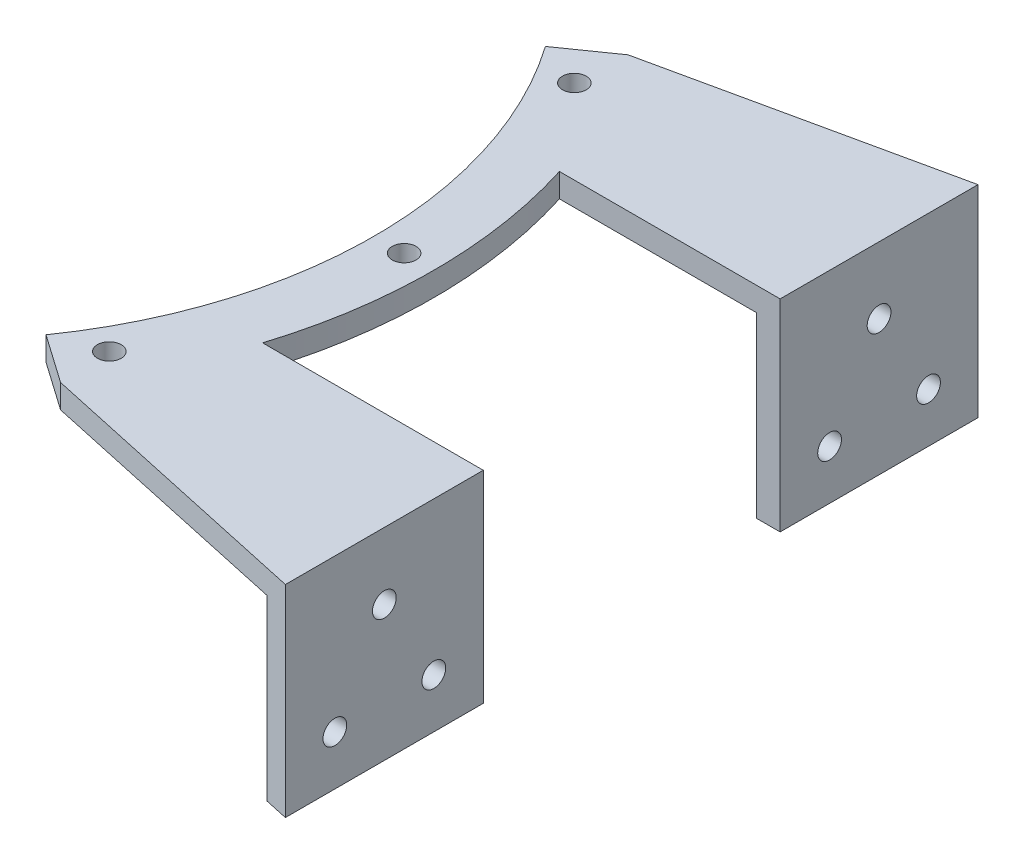
ISO-10303-21;
HEADER;
FILE_DESCRIPTION(('STEP AP214'),'2;1');
FILE_NAME('part.step','',(''),(''),'','','');
FILE_SCHEMA(('AUTOMOTIVE_DESIGN { 1 0 10303 214 1 1 1 1 }'));
ENDSEC;
DATA;
#1=APPLICATION_CONTEXT('core data for automotive mechanical design processes');
#2=APPLICATION_PROTOCOL_DEFINITION('international standard','automotive_design',2000,#1);
#3=PRODUCT_CONTEXT('',#1,'mechanical');
#4=PRODUCT('Part','Part','',(#3));
#5=PRODUCT_RELATED_PRODUCT_CATEGORY('part','',(#4));
#6=PRODUCT_DEFINITION_FORMATION('','',#4);
#7=PRODUCT_DEFINITION_CONTEXT('part definition',#1,'design');
#8=PRODUCT_DEFINITION('design','',#6,#7);
#9=PRODUCT_DEFINITION_SHAPE('','',#8);
#10=(LENGTH_UNIT() NAMED_UNIT(*) SI_UNIT(.MILLI.,.METRE.));
#11=(NAMED_UNIT(*) PLANE_ANGLE_UNIT() SI_UNIT($,.RADIAN.));
#12=(NAMED_UNIT(*) SI_UNIT($,.STERADIAN.) SOLID_ANGLE_UNIT());
#13=UNCERTAINTY_MEASURE_WITH_UNIT(LENGTH_MEASURE(1.E-05),#10,'distance_accuracy_value','');
#14=(GEOMETRIC_REPRESENTATION_CONTEXT(3) GLOBAL_UNCERTAINTY_ASSIGNED_CONTEXT((#13)) GLOBAL_UNIT_ASSIGNED_CONTEXT((#10,
#11,#12)) REPRESENTATION_CONTEXT('',''));
#15=CARTESIAN_POINT('',(0.,0.,0.));
#16=DIRECTION('',(0.,0.,1.));
#17=DIRECTION('',(1.,0.,0.));
#18=AXIS2_PLACEMENT_3D('',#15,#16,#17);
#19=CARTESIAN_POINT('',(0.,0.,0.));
#20=DIRECTION('',(0.,1.,0.));
#21=DIRECTION('',(0.,0.,1.));
#22=AXIS2_PLACEMENT_3D('',#19,#20,#21);
#23=PLANE('',#22);
#24=CARTESIAN_POINT('',(203.515969889343,0.,117.5));
#25=DIRECTION('',(0.,1.,0.));
#26=DIRECTION('',(0.,0.,1.));
#27=AXIS2_PLACEMENT_3D('',#24,#25,#26);
#28=CIRCLE('',#27,5.99999999999999);
#29=CARTESIAN_POINT('',(203.515969889343,0.,123.5));
#30=VERTEX_POINT('',#29);
#31=EDGE_CURVE('E191',#30,#30,#28,.T.);
#32=ORIENTED_EDGE('',*,*,#31,.T.);
#33=EDGE_LOOP('',(#32));
#34=FACE_BOUND('',#33,.T.);
#35=CARTESIAN_POINT('',(235.,0.,0.));
#36=DIRECTION('',(0.,1.,0.));
#37=DIRECTION('',(0.,0.,1.));
#38=AXIS2_PLACEMENT_3D('',#35,#36,#37);
#39=CIRCLE('',#38,5.99999999999999);
#40=CARTESIAN_POINT('',(235.,0.,5.99999999999999));
#41=VERTEX_POINT('',#40);
#42=EDGE_CURVE('E185',#41,#41,#39,.T.);
#43=ORIENTED_EDGE('',*,*,#42,.T.);
#44=EDGE_LOOP('',(#43));
#45=FACE_BOUND('',#44,.T.);
#46=CARTESIAN_POINT('',(203.515969889343,0.,-117.5));
#47=DIRECTION('',(0.,1.,0.));
#48=DIRECTION('',(0.,0.,1.));
#49=AXIS2_PLACEMENT_3D('',#46,#47,#48);
#50=CIRCLE('',#49,5.99999999999999);
#51=CARTESIAN_POINT('',(203.515969889343,0.,-111.5));
#52=VERTEX_POINT('',#51);
#53=EDGE_CURVE('E181',#52,#52,#50,.T.);
#54=ORIENTED_EDGE('',*,*,#53,.T.);
#55=EDGE_LOOP('',(#54));
#56=FACE_BOUND('',#55,.T.);
#57=DIRECTION('',(0.,0.,-1.));
#58=VECTOR('',#57,1.);
#59=CARTESIAN_POINT('',(338.,0.,-172.388158555313));
#60=LINE('',#59,#58);
#61=CARTESIAN_POINT('',(338.,0.,-75.));
#62=VERTEX_POINT('',#61);
#63=CARTESIAN_POINT('',(338.,0.,-172.388158555313));
#64=VERTEX_POINT('',#63);
#65=EDGE_CURVE('E153',#62,#64,#60,.T.);
#66=ORIENTED_EDGE('',*,*,#65,.F.);
#67=DIRECTION('',(1.,0.,0.));
#68=VECTOR('',#67,1.);
#69=CARTESIAN_POINT('',(350.,0.,-75.));
#70=LINE('',#69,#68);
#71=CARTESIAN_POINT('',(238.484800354236,0.,-75.));
#72=VERTEX_POINT('',#71);
#73=EDGE_CURVE('E158',#72,#62,#70,.T.);
#74=ORIENTED_EDGE('',*,*,#73,.F.);
#75=CARTESIAN_POINT('',(0.,0.,0.));
#76=DIRECTION('',(0.,1.,0.));
#77=DIRECTION('',(0.,0.,1.));
#78=AXIS2_PLACEMENT_3D('',#75,#76,#77);
#79=CIRCLE('',#78,250.);
#80=CARTESIAN_POINT('',(238.484800354236,0.,75.));
#81=VERTEX_POINT('',#80);
#82=EDGE_CURVE('E203',#81,#72,#79,.T.);
#83=ORIENTED_EDGE('',*,*,#82,.F.);
#84=DIRECTION('',(-1.,0.,0.));
#85=VECTOR('',#84,1.);
#86=CARTESIAN_POINT('',(350.,0.,75.));
#87=LINE('',#86,#85);
#88=CARTESIAN_POINT('',(338.,0.,75.));
#89=VERTEX_POINT('',#88);
#90=EDGE_CURVE('E233',#89,#81,#87,.T.);
#91=ORIENTED_EDGE('',*,*,#90,.F.);
#92=DIRECTION('',(0.,0.,-1.));
#93=VECTOR('',#92,1.);
#94=CARTESIAN_POINT('',(338.,0.,75.));
#95=LINE('',#94,#93);
#96=CARTESIAN_POINT('',(338.,0.,172.388158555313));
#97=VERTEX_POINT('',#96);
#98=EDGE_CURVE('E58',#97,#89,#95,.T.);
#99=ORIENTED_EDGE('',*,*,#98,.F.);
#100=DIRECTION('',(0.97712316091758,0.,0.212674230687305));
#101=VECTOR('',#100,1.);
#102=CARTESIAN_POINT('',(204.788011072248,0.,143.394109087761));
#103=LINE('',#102,#101);
#104=CARTESIAN_POINT('',(204.788011072248,0.,143.394109087761));
#105=VERTEX_POINT('',#104);
#106=EDGE_CURVE('E231',#105,#97,#103,.T.);
#107=ORIENTED_EDGE('',*,*,#106,.F.);
#108=DIRECTION('',(0.819152044288993,0.,0.573576436351044));
#109=VECTOR('',#108,1.);
#110=CARTESIAN_POINT('',(180.213449743579,0.,126.18681599723));
#111=LINE('',#110,#109);
#112=CARTESIAN_POINT('',(180.213449743578,0.,126.18681599723));
#113=VERTEX_POINT('',#112);
#114=EDGE_CURVE('E229',#113,#105,#111,.T.);
#115=ORIENTED_EDGE('',*,*,#114,.F.);
#116=CARTESIAN_POINT('',(0.,0.,0.));
#117=DIRECTION('',(0.,-1.,0.));
#118=DIRECTION('',(0.,0.,1.));
#119=AXIS2_PLACEMENT_3D('',#116,#117,#118);
#120=CIRCLE('',#119,220.);
#121=CARTESIAN_POINT('',(180.213449743579,0.,-126.18681599723));
#122=VERTEX_POINT('',#121);
#123=EDGE_CURVE('E227',#122,#113,#120,.T.);
#124=ORIENTED_EDGE('',*,*,#123,.F.);
#125=DIRECTION('',(-0.819152044288993,0.,0.573576436351044));
#126=VECTOR('',#125,1.);
#127=CARTESIAN_POINT('',(180.213449743579,0.,-126.18681599723));
#128=LINE('',#127,#126);
#129=CARTESIAN_POINT('',(204.788011072248,0.,-143.394109087761));
#130=VERTEX_POINT('',#129);
#131=EDGE_CURVE('E225',#130,#122,#128,.T.);
#132=ORIENTED_EDGE('',*,*,#131,.F.);
#133=DIRECTION('',(-0.97712316091758,0.,0.212674230687305));
#134=VECTOR('',#133,1.);
#135=CARTESIAN_POINT('',(204.788011072248,0.,-143.394109087761));
#136=LINE('',#135,#134);
#137=EDGE_CURVE('E223',#64,#130,#136,.T.);
#138=ORIENTED_EDGE('',*,*,#137,.F.);
#139=EDGE_LOOP('',(#66,#74,#83,#91,#99,#107,#115,#124,#132,#138));
#140=FACE_BOUND('',#139,.T.);
#141=ADVANCED_FACE('F35',(#34,#45,#56,#140),#23,.F.);
#142=CARTESIAN_POINT('',(0.,12.,0.));
#143=DIRECTION('',(0.,1.,0.));
#144=DIRECTION('',(0.,0.,1.));
#145=AXIS2_PLACEMENT_3D('',#142,#143,#144);
#146=PLANE('',#145);
#147=CARTESIAN_POINT('',(235.,12.,0.));
#148=DIRECTION('',(0.,1.,0.));
#149=DIRECTION('',(0.,0.,1.));
#150=AXIS2_PLACEMENT_3D('',#147,#148,#149);
#151=CIRCLE('',#150,5.99999999999999);
#152=CARTESIAN_POINT('',(235.,12.,5.99999999999999));
#153=VERTEX_POINT('',#152);
#154=EDGE_CURVE('E188',#153,#153,#151,.T.);
#155=ORIENTED_EDGE('',*,*,#154,.F.);
#156=EDGE_LOOP('',(#155));
#157=FACE_BOUND('',#156,.T.);
#158=DIRECTION('',(1.,0.,0.));
#159=VECTOR('',#158,1.);
#160=CARTESIAN_POINT('',(350.,12.,-75.));
#161=LINE('',#160,#159);
#162=CARTESIAN_POINT('',(238.484800354236,12.,-75.));
#163=VERTEX_POINT('',#162);
#164=CARTESIAN_POINT('',(350.,12.,-75.));
#165=VERTEX_POINT('',#164);
#166=EDGE_CURVE('E199',#163,#165,#161,.T.);
#167=ORIENTED_EDGE('',*,*,#166,.T.);
#168=DIRECTION('',(0.,0.,-1.));
#169=VECTOR('',#168,1.);
#170=CARTESIAN_POINT('',(350.,12.,-175.));
#171=LINE('',#170,#169);
#172=CARTESIAN_POINT('',(350.,12.,-175.));
#173=VERTEX_POINT('',#172);
#174=EDGE_CURVE('E202',#165,#173,#171,.T.);
#175=ORIENTED_EDGE('',*,*,#174,.T.);
#176=DIRECTION('',(-0.97712316091758,0.,0.212674230687305));
#177=VECTOR('',#176,1.);
#178=CARTESIAN_POINT('',(204.788011072248,12.,-143.394109087761));
#179=LINE('',#178,#177);
#180=CARTESIAN_POINT('',(204.788011072248,12.,-143.394109087761));
#181=VERTEX_POINT('',#180);
#182=EDGE_CURVE('E205',#173,#181,#179,.T.);
#183=ORIENTED_EDGE('',*,*,#182,.T.);
#184=DIRECTION('',(-0.819152044288993,0.,0.573576436351044));
#185=VECTOR('',#184,1.);
#186=CARTESIAN_POINT('',(180.213449743579,12.,-126.18681599723));
#187=LINE('',#186,#185);
#188=CARTESIAN_POINT('',(180.213449743579,12.,-126.18681599723));
#189=VERTEX_POINT('',#188);
#190=EDGE_CURVE('E207',#181,#189,#187,.T.);
#191=ORIENTED_EDGE('',*,*,#190,.T.);
#192=CARTESIAN_POINT('',(0.,12.,0.));
#193=DIRECTION('',(0.,-1.,0.));
#194=DIRECTION('',(0.,0.,1.));
#195=AXIS2_PLACEMENT_3D('',#192,#193,#194);
#196=CIRCLE('',#195,220.);
#197=CARTESIAN_POINT('',(180.213449743578,12.,126.18681599723));
#198=VERTEX_POINT('',#197);
#199=EDGE_CURVE('E209',#189,#198,#196,.T.);
#200=ORIENTED_EDGE('',*,*,#199,.T.);
#201=DIRECTION('',(0.819152044288993,0.,0.573576436351044));
#202=VECTOR('',#201,1.);
#203=CARTESIAN_POINT('',(180.213449743579,12.,126.18681599723));
#204=LINE('',#203,#202);
#205=CARTESIAN_POINT('',(204.788011072248,12.,143.394109087761));
#206=VERTEX_POINT('',#205);
#207=EDGE_CURVE('E211',#198,#206,#204,.T.);
#208=ORIENTED_EDGE('',*,*,#207,.T.);
#209=DIRECTION('',(0.97712316091758,0.,0.212674230687305));
#210=VECTOR('',#209,1.);
#211=CARTESIAN_POINT('',(204.788011072248,12.,143.394109087761));
#212=LINE('',#211,#210);
#213=CARTESIAN_POINT('',(350.,12.,175.));
#214=VERTEX_POINT('',#213);
#215=EDGE_CURVE('E213',#206,#214,#212,.T.);
#216=ORIENTED_EDGE('',*,*,#215,.T.);
#217=DIRECTION('',(0.,0.,-1.));
#218=VECTOR('',#217,1.);
#219=CARTESIAN_POINT('',(350.,12.,175.));
#220=LINE('',#219,#218);
#221=CARTESIAN_POINT('',(350.,12.,75.));
#222=VERTEX_POINT('',#221);
#223=EDGE_CURVE('E215',#214,#222,#220,.T.);
#224=ORIENTED_EDGE('',*,*,#223,.T.);
#225=DIRECTION('',(-1.,0.,0.));
#226=VECTOR('',#225,1.);
#227=CARTESIAN_POINT('',(350.,12.,75.));
#228=LINE('',#227,#226);
#229=CARTESIAN_POINT('',(238.484800354236,12.,75.));
#230=VERTEX_POINT('',#229);
#231=EDGE_CURVE('E217',#222,#230,#228,.T.);
#232=ORIENTED_EDGE('',*,*,#231,.T.);
#233=CARTESIAN_POINT('',(0.,12.,0.));
#234=DIRECTION('',(0.,1.,0.));
#235=DIRECTION('',(0.,0.,1.));
#236=AXIS2_PLACEMENT_3D('',#233,#234,#235);
#237=CIRCLE('',#236,250.);
#238=EDGE_CURVE('E219',#230,#163,#237,.T.);
#239=ORIENTED_EDGE('',*,*,#238,.T.);
#240=EDGE_LOOP('',(#167,#175,#183,#191,#200,#208,#216,#224,#232,#239));
#241=FACE_BOUND('',#240,.T.);
#242=CARTESIAN_POINT('',(203.515969889343,12.,117.5));
#243=DIRECTION('',(0.,1.,0.));
#244=DIRECTION('',(0.,0.,1.));
#245=AXIS2_PLACEMENT_3D('',#242,#243,#244);
#246=CIRCLE('',#245,5.99999999999999);
#247=CARTESIAN_POINT('',(203.515969889343,12.,123.5));
#248=VERTEX_POINT('',#247);
#249=EDGE_CURVE('E194',#248,#248,#246,.T.);
#250=ORIENTED_EDGE('',*,*,#249,.F.);
#251=EDGE_LOOP('',(#250));
#252=FACE_BOUND('',#251,.T.);
#253=CARTESIAN_POINT('',(203.515969889343,12.,-117.5));
#254=DIRECTION('',(0.,1.,0.));
#255=DIRECTION('',(0.,0.,1.));
#256=AXIS2_PLACEMENT_3D('',#253,#254,#255);
#257=CIRCLE('',#256,5.99999999999999);
#258=CARTESIAN_POINT('',(203.515969889343,12.,-111.5));
#259=VERTEX_POINT('',#258);
#260=EDGE_CURVE('E182',#259,#259,#257,.T.);
#261=ORIENTED_EDGE('',*,*,#260,.F.);
#262=EDGE_LOOP('',(#261));
#263=FACE_BOUND('',#262,.T.);
#264=ADVANCED_FACE('F355',(#157,#241,#252,#263),#146,.T.);
#265=CARTESIAN_POINT('',(350.,12.,-75.));
#266=DIRECTION('',(0.,0.,-1.));
#267=DIRECTION('',(-1.,0.,0.));
#268=AXIS2_PLACEMENT_3D('',#265,#266,#267);
#269=PLANE('',#268);
#270=ORIENTED_EDGE('',*,*,#73,.T.);
#271=DIRECTION('',(0.,1.,0.));
#272=VECTOR('',#271,1.);
#273=CARTESIAN_POINT('',(338.,-90.,-75.));
#274=LINE('',#273,#272);
#275=CARTESIAN_POINT('',(338.,-90.,-75.));
#276=VERTEX_POINT('',#275);
#277=EDGE_CURVE('E139',#276,#62,#274,.T.);
#278=ORIENTED_EDGE('',*,*,#277,.F.);
#279=DIRECTION('',(-1.,0.,0.));
#280=VECTOR('',#279,1.);
#281=CARTESIAN_POINT('',(338.,-90.,-75.));
#282=LINE('',#281,#280);
#283=CARTESIAN_POINT('',(350.,-90.,-75.));
#284=VERTEX_POINT('',#283);
#285=EDGE_CURVE('E144',#284,#276,#282,.T.);
#286=ORIENTED_EDGE('',*,*,#285,.F.);
#287=DIRECTION('',(0.,-1.,0.));
#288=VECTOR('',#287,1.);
#289=CARTESIAN_POINT('',(350.,12.,-75.));
#290=LINE('',#289,#288);
#291=EDGE_CURVE('E11',#165,#284,#290,.T.);
#292=ORIENTED_EDGE('',*,*,#291,.F.);
#293=ORIENTED_EDGE('',*,*,#166,.F.);
#294=DIRECTION('',(0.,-1.,0.));
#295=VECTOR('',#294,1.);
#296=CARTESIAN_POINT('',(238.484800354236,12.,-75.));
#297=LINE('',#296,#295);
#298=EDGE_CURVE('E221',#163,#72,#297,.T.);
#299=ORIENTED_EDGE('',*,*,#298,.T.);
#300=EDGE_LOOP('',(#270,#278,#286,#292,#293,#299));
#301=FACE_BOUND('',#300,.T.);
#302=ADVANCED_FACE('F37',(#301),#269,.F.);
#303=CARTESIAN_POINT('',(350.,12.,-175.));
#304=DIRECTION('',(-1.,0.,0.));
#305=DIRECTION('',(0.,0.,1.));
#306=AXIS2_PLACEMENT_3D('',#303,#304,#305);
#307=PLANE('',#306);
#308=CARTESIAN_POINT('',(350.,-65.,-150.));
#309=DIRECTION('',(-1.,0.,0.));
#310=DIRECTION('',(0.,0.,1.));
#311=AXIS2_PLACEMENT_3D('',#308,#309,#310);
#312=CIRCLE('',#311,6.00000000000002);
#313=CARTESIAN_POINT('',(350.,-65.,-144.));
#314=VERTEX_POINT('',#313);
#315=EDGE_CURVE('E263',#314,#314,#312,.T.);
#316=ORIENTED_EDGE('',*,*,#315,.T.);
#317=EDGE_LOOP('',(#316));
#318=FACE_BOUND('',#317,.T.);
#319=CARTESIAN_POINT('',(350.,-21.6987298107781,-125.));
#320=DIRECTION('',(-1.,0.,0.));
#321=DIRECTION('',(0.,0.,1.));
#322=AXIS2_PLACEMENT_3D('',#319,#320,#321);
#323=CIRCLE('',#322,6.);
#324=CARTESIAN_POINT('',(350.,-21.6987298107781,-119.));
#325=VERTEX_POINT('',#324);
#326=EDGE_CURVE('E286',#325,#325,#323,.T.);
#327=ORIENTED_EDGE('',*,*,#326,.T.);
#328=EDGE_LOOP('',(#327));
#329=FACE_BOUND('',#328,.T.);
#330=CARTESIAN_POINT('',(350.,-65.,-100.));
#331=DIRECTION('',(-1.,0.,0.));
#332=DIRECTION('',(0.,0.,1.));
#333=AXIS2_PLACEMENT_3D('',#330,#331,#332);
#334=CIRCLE('',#333,6.);
#335=CARTESIAN_POINT('',(350.,-65.,-94.));
#336=VERTEX_POINT('',#335);
#337=EDGE_CURVE('E271',#336,#336,#334,.T.);
#338=ORIENTED_EDGE('',*,*,#337,.T.);
#339=EDGE_LOOP('',(#338));
#340=FACE_BOUND('',#339,.T.);
#341=ORIENTED_EDGE('',*,*,#291,.T.);
#342=DIRECTION('',(0.,0.,1.));
#343=VECTOR('',#342,1.);
#344=CARTESIAN_POINT('',(350.,-90.,-75.));
#345=LINE('',#344,#343);
#346=CARTESIAN_POINT('',(350.,-90.,-175.));
#347=VERTEX_POINT('',#346);
#348=EDGE_CURVE('E150',#347,#284,#345,.T.);
#349=ORIENTED_EDGE('',*,*,#348,.F.);
#350=DIRECTION('',(0.,-1.,0.));
#351=VECTOR('',#350,1.);
#352=CARTESIAN_POINT('',(350.,12.,-175.));
#353=LINE('',#352,#351);
#354=EDGE_CURVE('E43',#173,#347,#353,.T.);
#355=ORIENTED_EDGE('',*,*,#354,.F.);
#356=ORIENTED_EDGE('',*,*,#174,.F.);
#357=EDGE_LOOP('',(#341,#349,#355,#356));
#358=FACE_BOUND('',#357,.T.);
#359=ADVANCED_FACE('F261',(#318,#329,#340,#358),#307,.F.);
#360=CARTESIAN_POINT('',(204.788011072248,12.,-143.394109087761));
#361=DIRECTION('',(0.212674230687305,0.,0.97712316091758));
#362=DIRECTION('',(0.97712316091758,0.,-0.212674230687305));
#363=AXIS2_PLACEMENT_3D('',#360,#361,#362);
#364=PLANE('',#363);
#365=ORIENTED_EDGE('',*,*,#354,.T.);
#366=DIRECTION('',(0.977123160917581,0.,-0.212674230687303));
#367=VECTOR('',#366,1.);
#368=CARTESIAN_POINT('',(350.,-90.,-175.));
#369=LINE('',#368,#367);
#370=CARTESIAN_POINT('',(338.,-90.,-172.388158555313));
#371=VERTEX_POINT('',#370);
#372=EDGE_CURVE('E143',#371,#347,#369,.T.);
#373=ORIENTED_EDGE('',*,*,#372,.F.);
#374=DIRECTION('',(0.,1.,0.));
#375=VECTOR('',#374,1.);
#376=CARTESIAN_POINT('',(338.,-90.,-172.388158555313));
#377=LINE('',#376,#375);
#378=EDGE_CURVE('E50',#371,#64,#377,.T.);
#379=ORIENTED_EDGE('',*,*,#378,.T.);
#380=ORIENTED_EDGE('',*,*,#137,.T.);
#381=DIRECTION('',(0.,-1.,0.));
#382=VECTOR('',#381,1.);
#383=CARTESIAN_POINT('',(204.788011072248,12.,-143.394109087761));
#384=LINE('',#383,#382);
#385=EDGE_CURVE('E253',#181,#130,#384,.T.);
#386=ORIENTED_EDGE('',*,*,#385,.F.);
#387=ORIENTED_EDGE('',*,*,#182,.F.);
#388=EDGE_LOOP('',(#365,#373,#379,#380,#386,#387));
#389=FACE_BOUND('',#388,.T.);
#390=ADVANCED_FACE('F257',(#389),#364,.F.);
#391=CARTESIAN_POINT('',(180.213449743579,12.,-126.18681599723));
#392=DIRECTION('',(0.573576436351044,0.,0.819152044288993));
#393=DIRECTION('',(0.819152044288993,0.,-0.573576436351044));
#394=AXIS2_PLACEMENT_3D('',#391,#392,#393);
#395=PLANE('',#394);
#396=ORIENTED_EDGE('',*,*,#131,.T.);
#397=DIRECTION('',(0.,-1.,0.));
#398=VECTOR('',#397,1.);
#399=CARTESIAN_POINT('',(180.213449743579,12.,-126.18681599723));
#400=LINE('',#399,#398);
#401=EDGE_CURVE('E250',#189,#122,#400,.T.);
#402=ORIENTED_EDGE('',*,*,#401,.F.);
#403=ORIENTED_EDGE('',*,*,#190,.F.);
#404=ORIENTED_EDGE('',*,*,#385,.T.);
#405=EDGE_LOOP('',(#396,#402,#403,#404));
#406=FACE_BOUND('',#405,.T.);
#407=ADVANCED_FACE('F347',(#406),#395,.F.);
#408=CARTESIAN_POINT('',(0.,12.,0.));
#409=DIRECTION('',(0.,-1.,0.));
#410=DIRECTION('',(0.,0.,-1.));
#411=AXIS2_PLACEMENT_3D('',#408,#409,#410);
#412=CYLINDRICAL_SURFACE('',#411,220.);
#413=ORIENTED_EDGE('',*,*,#123,.T.);
#414=DIRECTION('',(0.,-1.,0.));
#415=VECTOR('',#414,1.);
#416=CARTESIAN_POINT('',(180.213449743578,12.,126.18681599723));
#417=LINE('',#416,#415);
#418=EDGE_CURVE('E247',#198,#113,#417,.T.);
#419=ORIENTED_EDGE('',*,*,#418,.F.);
#420=ORIENTED_EDGE('',*,*,#199,.F.);
#421=ORIENTED_EDGE('',*,*,#401,.T.);
#422=EDGE_LOOP('',(#413,#419,#420,#421));
#423=FACE_BOUND('',#422,.T.);
#424=ADVANCED_FACE('F343',(#423),#412,.F.);
#425=CARTESIAN_POINT('',(180.213449743579,12.,126.18681599723));
#426=DIRECTION('',(0.573576436351044,0.,-0.819152044288993));
#427=DIRECTION('',(-0.819152044288993,0.,-0.573576436351044));
#428=AXIS2_PLACEMENT_3D('',#425,#426,#427);
#429=PLANE('',#428);
#430=ORIENTED_EDGE('',*,*,#114,.T.);
#431=DIRECTION('',(0.,-1.,0.));
#432=VECTOR('',#431,1.);
#433=CARTESIAN_POINT('',(204.788011072248,12.,143.394109087761));
#434=LINE('',#433,#432);
#435=EDGE_CURVE('E244',#206,#105,#434,.T.);
#436=ORIENTED_EDGE('',*,*,#435,.F.);
#437=ORIENTED_EDGE('',*,*,#207,.F.);
#438=ORIENTED_EDGE('',*,*,#418,.T.);
#439=EDGE_LOOP('',(#430,#436,#437,#438));
#440=FACE_BOUND('',#439,.T.);
#441=ADVANCED_FACE('F338',(#440),#429,.F.);
#442=CARTESIAN_POINT('',(204.788011072248,12.,143.394109087761));
#443=DIRECTION('',(0.212674230687305,0.,-0.97712316091758));
#444=DIRECTION('',(-0.97712316091758,0.,-0.212674230687305));
#445=AXIS2_PLACEMENT_3D('',#442,#443,#444);
#446=PLANE('',#445);
#447=ORIENTED_EDGE('',*,*,#106,.T.);
#448=DIRECTION('',(0.,1.,0.));
#449=VECTOR('',#448,1.);
#450=CARTESIAN_POINT('',(338.,-90.,172.388158555313));
#451=LINE('',#450,#449);
#452=CARTESIAN_POINT('',(338.,-90.,172.388158555313));
#453=VERTEX_POINT('',#452);
#454=EDGE_CURVE('E178',#453,#97,#451,.T.);
#455=ORIENTED_EDGE('',*,*,#454,.F.);
#456=DIRECTION('',(-0.97712316091758,0.,-0.212674230687306));
#457=VECTOR('',#456,1.);
#458=CARTESIAN_POINT('',(338.,-90.,172.388158555313));
#459=LINE('',#458,#457);
#460=CARTESIAN_POINT('',(350.,-90.,175.));
#461=VERTEX_POINT('',#460);
#462=EDGE_CURVE('E160',#461,#453,#459,.T.);
#463=ORIENTED_EDGE('',*,*,#462,.F.);
#464=DIRECTION('',(0.,-1.,0.));
#465=VECTOR('',#464,1.);
#466=CARTESIAN_POINT('',(350.,12.,175.));
#467=LINE('',#466,#465);
#468=EDGE_CURVE('E242',#214,#461,#467,.T.);
#469=ORIENTED_EDGE('',*,*,#468,.F.);
#470=ORIENTED_EDGE('',*,*,#215,.F.);
#471=ORIENTED_EDGE('',*,*,#435,.T.);
#472=EDGE_LOOP('',(#447,#455,#463,#469,#470,#471));
#473=FACE_BOUND('',#472,.T.);
#474=ADVANCED_FACE('F332',(#473),#446,.F.);
#475=CARTESIAN_POINT('',(350.,12.,175.));
#476=DIRECTION('',(-1.,0.,0.));
#477=DIRECTION('',(0.,0.,1.));
#478=AXIS2_PLACEMENT_3D('',#475,#476,#477);
#479=PLANE('',#478);
#480=CARTESIAN_POINT('',(350.,-65.,100.));
#481=DIRECTION('',(-1.,0.,0.));
#482=DIRECTION('',(0.,0.,-1.));
#483=AXIS2_PLACEMENT_3D('',#480,#481,#482);
#484=CIRCLE('',#483,6.);
#485=CARTESIAN_POINT('',(350.,-65.,94.));
#486=VERTEX_POINT('',#485);
#487=EDGE_CURVE('E274',#486,#486,#484,.T.);
#488=ORIENTED_EDGE('',*,*,#487,.T.);
#489=EDGE_LOOP('',(#488));
#490=FACE_BOUND('',#489,.T.);
#491=CARTESIAN_POINT('',(350.,-21.6987298107781,125.));
#492=DIRECTION('',(-1.,0.,0.));
#493=DIRECTION('',(0.,0.,-1.));
#494=AXIS2_PLACEMENT_3D('',#491,#492,#493);
#495=CIRCLE('',#494,6.);
#496=CARTESIAN_POINT('',(350.,-21.6987298107781,119.));
#497=VERTEX_POINT('',#496);
#498=EDGE_CURVE('E298',#497,#497,#495,.T.);
#499=ORIENTED_EDGE('',*,*,#498,.T.);
#500=EDGE_LOOP('',(#499));
#501=FACE_BOUND('',#500,.T.);
#502=CARTESIAN_POINT('',(350.,-65.,150.));
#503=DIRECTION('',(-1.,0.,0.));
#504=DIRECTION('',(0.,0.,-1.));
#505=AXIS2_PLACEMENT_3D('',#502,#503,#504);
#506=CIRCLE('',#505,6.00000000000002);
#507=CARTESIAN_POINT('',(350.,-65.,144.));
#508=VERTEX_POINT('',#507);
#509=EDGE_CURVE('E292',#508,#508,#506,.T.);
#510=ORIENTED_EDGE('',*,*,#509,.T.);
#511=EDGE_LOOP('',(#510));
#512=FACE_BOUND('',#511,.T.);
#513=ORIENTED_EDGE('',*,*,#468,.T.);
#514=DIRECTION('',(0.,0.,1.));
#515=VECTOR('',#514,1.);
#516=CARTESIAN_POINT('',(350.,-90.,175.));
#517=LINE('',#516,#515);
#518=CARTESIAN_POINT('',(350.,-90.,75.));
#519=VERTEX_POINT('',#518);
#520=EDGE_CURVE('E172',#519,#461,#517,.T.);
#521=ORIENTED_EDGE('',*,*,#520,.F.);
#522=DIRECTION('',(0.,-1.,0.));
#523=VECTOR('',#522,1.);
#524=CARTESIAN_POINT('',(350.,12.,75.));
#525=LINE('',#524,#523);
#526=EDGE_CURVE('E240',#222,#519,#525,.T.);
#527=ORIENTED_EDGE('',*,*,#526,.F.);
#528=ORIENTED_EDGE('',*,*,#223,.F.);
#529=EDGE_LOOP('',(#513,#521,#527,#528));
#530=FACE_BOUND('',#529,.T.);
#531=ADVANCED_FACE('F327',(#490,#501,#512,#530),#479,.F.);
#532=CARTESIAN_POINT('',(350.,12.,75.));
#533=DIRECTION('',(0.,0.,1.));
#534=DIRECTION('',(1.,0.,0.));
#535=AXIS2_PLACEMENT_3D('',#532,#533,#534);
#536=PLANE('',#535);
#537=ORIENTED_EDGE('',*,*,#526,.T.);
#538=DIRECTION('',(1.,0.,0.));
#539=VECTOR('',#538,1.);
#540=CARTESIAN_POINT('',(350.,-90.,75.));
#541=LINE('',#540,#539);
#542=CARTESIAN_POINT('',(338.,-90.,75.));
#543=VERTEX_POINT('',#542);
#544=EDGE_CURVE('E169',#543,#519,#541,.T.);
#545=ORIENTED_EDGE('',*,*,#544,.F.);
#546=DIRECTION('',(0.,1.,0.));
#547=VECTOR('',#546,1.);
#548=CARTESIAN_POINT('',(338.,-90.,75.));
#549=LINE('',#548,#547);
#550=EDGE_CURVE('E174',#543,#89,#549,.T.);
#551=ORIENTED_EDGE('',*,*,#550,.T.);
#552=ORIENTED_EDGE('',*,*,#90,.T.);
#553=DIRECTION('',(0.,-1.,0.));
#554=VECTOR('',#553,1.);
#555=CARTESIAN_POINT('',(238.484800354236,12.,75.));
#556=LINE('',#555,#554);
#557=EDGE_CURVE('E237',#230,#81,#556,.T.);
#558=ORIENTED_EDGE('',*,*,#557,.F.);
#559=ORIENTED_EDGE('',*,*,#231,.F.);
#560=EDGE_LOOP('',(#537,#545,#551,#552,#558,#559));
#561=FACE_BOUND('',#560,.T.);
#562=ADVANCED_FACE('F319',(#561),#536,.F.);
#563=CARTESIAN_POINT('',(0.,12.,0.));
#564=DIRECTION('',(0.,-1.,0.));
#565=DIRECTION('',(0.,0.,-1.));
#566=AXIS2_PLACEMENT_3D('',#563,#564,#565);
#567=CYLINDRICAL_SURFACE('',#566,250.);
#568=ORIENTED_EDGE('',*,*,#82,.T.);
#569=ORIENTED_EDGE('',*,*,#298,.F.);
#570=ORIENTED_EDGE('',*,*,#238,.F.);
#571=ORIENTED_EDGE('',*,*,#557,.T.);
#572=EDGE_LOOP('',(#568,#569,#570,#571));
#573=FACE_BOUND('',#572,.T.);
#574=ADVANCED_FACE('F351',(#573),#567,.T.);
#575=CARTESIAN_POINT('',(203.515969889343,12.,117.5));
#576=DIRECTION('',(0.,-1.,0.));
#577=DIRECTION('',(0.,0.,-1.));
#578=AXIS2_PLACEMENT_3D('',#575,#576,#577);
#579=CYLINDRICAL_SURFACE('',#578,5.99999999999999);
#580=ORIENTED_EDGE('',*,*,#249,.T.);
#581=EDGE_LOOP('',(#580));
#582=FACE_BOUND('',#581,.T.);
#583=ORIENTED_EDGE('',*,*,#31,.F.);
#584=EDGE_LOOP('',(#583));
#585=FACE_BOUND('',#584,.T.);
#586=ADVANCED_FACE('F380',(#582,#585),#579,.F.);
#587=CARTESIAN_POINT('',(235.,12.,0.));
#588=DIRECTION('',(0.,-1.,0.));
#589=DIRECTION('',(0.,0.,-1.));
#590=AXIS2_PLACEMENT_3D('',#587,#588,#589);
#591=CYLINDRICAL_SURFACE('',#590,5.99999999999999);
#592=ORIENTED_EDGE('',*,*,#154,.T.);
#593=EDGE_LOOP('',(#592));
#594=FACE_BOUND('',#593,.T.);
#595=ORIENTED_EDGE('',*,*,#42,.F.);
#596=EDGE_LOOP('',(#595));
#597=FACE_BOUND('',#596,.T.);
#598=ADVANCED_FACE('F366',(#594,#597),#591,.F.);
#599=CARTESIAN_POINT('',(203.515969889343,12.,-117.5));
#600=DIRECTION('',(0.,-1.,0.));
#601=DIRECTION('',(0.,0.,-1.));
#602=AXIS2_PLACEMENT_3D('',#599,#600,#601);
#603=CYLINDRICAL_SURFACE('',#602,5.99999999999999);
#604=ORIENTED_EDGE('',*,*,#260,.T.);
#605=EDGE_LOOP('',(#604));
#606=FACE_BOUND('',#605,.T.);
#607=ORIENTED_EDGE('',*,*,#53,.F.);
#608=EDGE_LOOP('',(#607));
#609=FACE_BOUND('',#608,.T.);
#610=ADVANCED_FACE('F310',(#606,#609),#603,.F.);
#611=CARTESIAN_POINT('',(338.,-90.,75.));
#612=DIRECTION('',(1.,0.,0.));
#613=DIRECTION('',(0.,0.,-1.));
#614=AXIS2_PLACEMENT_3D('',#611,#612,#613);
#615=PLANE('',#614);
#616=CARTESIAN_POINT('',(338.,-65.,100.));
#617=DIRECTION('',(-1.,0.,0.));
#618=DIRECTION('',(0.,0.,-1.));
#619=AXIS2_PLACEMENT_3D('',#616,#617,#618);
#620=CIRCLE('',#619,6.);
#621=CARTESIAN_POINT('',(338.,-65.,94.));
#622=VERTEX_POINT('',#621);
#623=EDGE_CURVE('E278',#622,#622,#620,.T.);
#624=ORIENTED_EDGE('',*,*,#623,.F.);
#625=EDGE_LOOP('',(#624));
#626=FACE_BOUND('',#625,.T.);
#627=CARTESIAN_POINT('',(338.,-21.6987298107781,125.));
#628=DIRECTION('',(-1.,0.,0.));
#629=DIRECTION('',(0.,0.,-1.));
#630=AXIS2_PLACEMENT_3D('',#627,#628,#629);
#631=CIRCLE('',#630,6.);
#632=CARTESIAN_POINT('',(338.,-21.6987298107781,119.));
#633=VERTEX_POINT('',#632);
#634=EDGE_CURVE('E277',#633,#633,#631,.T.);
#635=ORIENTED_EDGE('',*,*,#634,.F.);
#636=EDGE_LOOP('',(#635));
#637=FACE_BOUND('',#636,.T.);
#638=CARTESIAN_POINT('',(338.,-65.,150.));
#639=DIRECTION('',(-1.,0.,0.));
#640=DIRECTION('',(0.,0.,-1.));
#641=AXIS2_PLACEMENT_3D('',#638,#639,#640);
#642=CIRCLE('',#641,6.00000000000002);
#643=CARTESIAN_POINT('',(338.,-65.,144.));
#644=VERTEX_POINT('',#643);
#645=EDGE_CURVE('E295',#644,#644,#642,.T.);
#646=ORIENTED_EDGE('',*,*,#645,.F.);
#647=EDGE_LOOP('',(#646));
#648=FACE_BOUND('',#647,.T.);
#649=ORIENTED_EDGE('',*,*,#98,.T.);
#650=ORIENTED_EDGE('',*,*,#550,.F.);
#651=DIRECTION('',(0.,0.,-1.));
#652=VECTOR('',#651,1.);
#653=CARTESIAN_POINT('',(338.,-90.,75.));
#654=LINE('',#653,#652);
#655=EDGE_CURVE('E167',#453,#543,#654,.T.);
#656=ORIENTED_EDGE('',*,*,#655,.F.);
#657=ORIENTED_EDGE('',*,*,#454,.T.);
#658=EDGE_LOOP('',(#649,#650,#656,#657));
#659=FACE_BOUND('',#658,.T.);
#660=ADVANCED_FACE('F306',(#626,#637,#648,#659),#615,.F.);
#661=CARTESIAN_POINT('',(0.,-90.,0.));
#662=DIRECTION('',(0.,1.,0.));
#663=DIRECTION('',(0.,0.,1.));
#664=AXIS2_PLACEMENT_3D('',#661,#662,#663);
#665=PLANE('',#664);
#666=ORIENTED_EDGE('',*,*,#462,.T.);
#667=ORIENTED_EDGE('',*,*,#655,.T.);
#668=ORIENTED_EDGE('',*,*,#544,.T.);
#669=ORIENTED_EDGE('',*,*,#520,.T.);
#670=EDGE_LOOP('',(#666,#667,#668,#669));
#671=FACE_BOUND('',#670,.T.);
#672=ADVANCED_FACE('F309',(#671),#665,.F.);
#673=CARTESIAN_POINT('',(338.,-90.,-172.388158555313));
#674=DIRECTION('',(1.,0.,0.));
#675=DIRECTION('',(0.,0.,-1.));
#676=AXIS2_PLACEMENT_3D('',#673,#674,#675);
#677=PLANE('',#676);
#678=CARTESIAN_POINT('',(338.,-65.,-150.));
#679=DIRECTION('',(-1.,0.,0.));
#680=DIRECTION('',(0.,0.,1.));
#681=AXIS2_PLACEMENT_3D('',#678,#679,#680);
#682=CIRCLE('',#681,6.00000000000002);
#683=CARTESIAN_POINT('',(338.,-65.,-144.));
#684=VERTEX_POINT('',#683);
#685=EDGE_CURVE('E266',#684,#684,#682,.T.);
#686=ORIENTED_EDGE('',*,*,#685,.F.);
#687=EDGE_LOOP('',(#686));
#688=FACE_BOUND('',#687,.T.);
#689=CARTESIAN_POINT('',(338.,-21.6987298107781,-125.));
#690=DIRECTION('',(-1.,0.,0.));
#691=DIRECTION('',(0.,0.,1.));
#692=AXIS2_PLACEMENT_3D('',#689,#690,#691);
#693=CIRCLE('',#692,6.);
#694=CARTESIAN_POINT('',(338.,-21.6987298107781,-119.));
#695=VERTEX_POINT('',#694);
#696=EDGE_CURVE('E289',#695,#695,#693,.T.);
#697=ORIENTED_EDGE('',*,*,#696,.F.);
#698=EDGE_LOOP('',(#697));
#699=FACE_BOUND('',#698,.T.);
#700=CARTESIAN_POINT('',(338.,-65.,-100.));
#701=DIRECTION('',(-1.,0.,0.));
#702=DIRECTION('',(0.,0.,1.));
#703=AXIS2_PLACEMENT_3D('',#700,#701,#702);
#704=CIRCLE('',#703,6.);
#705=CARTESIAN_POINT('',(338.,-65.,-94.));
#706=VERTEX_POINT('',#705);
#707=EDGE_CURVE('E283',#706,#706,#704,.T.);
#708=ORIENTED_EDGE('',*,*,#707,.F.);
#709=EDGE_LOOP('',(#708));
#710=FACE_BOUND('',#709,.T.);
#711=ORIENTED_EDGE('',*,*,#65,.T.);
#712=ORIENTED_EDGE('',*,*,#378,.F.);
#713=DIRECTION('',(0.,0.,-1.));
#714=VECTOR('',#713,1.);
#715=CARTESIAN_POINT('',(338.,-90.,-172.388158555313));
#716=LINE('',#715,#714);
#717=EDGE_CURVE('E135',#276,#371,#716,.T.);
#718=ORIENTED_EDGE('',*,*,#717,.F.);
#719=ORIENTED_EDGE('',*,*,#277,.T.);
#720=EDGE_LOOP('',(#711,#712,#718,#719));
#721=FACE_BOUND('',#720,.T.);
#722=ADVANCED_FACE('F137',(#688,#699,#710,#721),#677,.F.);
#723=CARTESIAN_POINT('',(0.,-90.,0.));
#724=DIRECTION('',(0.,1.,0.));
#725=DIRECTION('',(0.,0.,1.));
#726=AXIS2_PLACEMENT_3D('',#723,#724,#725);
#727=PLANE('',#726);
#728=ORIENTED_EDGE('',*,*,#285,.T.);
#729=ORIENTED_EDGE('',*,*,#717,.T.);
#730=ORIENTED_EDGE('',*,*,#372,.T.);
#731=ORIENTED_EDGE('',*,*,#348,.T.);
#732=EDGE_LOOP('',(#728,#729,#730,#731));
#733=FACE_BOUND('',#732,.T.);
#734=ADVANCED_FACE('F148',(#733),#727,.F.);
#735=CARTESIAN_POINT('',(350.,-65.,-100.));
#736=DIRECTION('',(-1.,0.,0.));
#737=DIRECTION('',(0.,0.,1.));
#738=AXIS2_PLACEMENT_3D('',#735,#736,#737);
#739=CYLINDRICAL_SURFACE('',#738,6.);
#740=ORIENTED_EDGE('',*,*,#337,.F.);
#741=EDGE_LOOP('',(#740));
#742=FACE_BOUND('',#741,.T.);
#743=ORIENTED_EDGE('',*,*,#707,.T.);
#744=EDGE_LOOP('',(#743));
#745=FACE_BOUND('',#744,.T.);
#746=ADVANCED_FACE('F404',(#742,#745),#739,.F.);
#747=CARTESIAN_POINT('',(350.,-21.6987298107781,-125.));
#748=DIRECTION('',(-1.,0.,0.));
#749=DIRECTION('',(0.,0.,1.));
#750=AXIS2_PLACEMENT_3D('',#747,#748,#749);
#751=CYLINDRICAL_SURFACE('',#750,6.);
#752=ORIENTED_EDGE('',*,*,#326,.F.);
#753=EDGE_LOOP('',(#752));
#754=FACE_BOUND('',#753,.T.);
#755=ORIENTED_EDGE('',*,*,#696,.T.);
#756=EDGE_LOOP('',(#755));
#757=FACE_BOUND('',#756,.T.);
#758=ADVANCED_FACE('F407',(#754,#757),#751,.F.);
#759=CARTESIAN_POINT('',(350.,-65.,-150.));
#760=DIRECTION('',(-1.,0.,0.));
#761=DIRECTION('',(0.,0.,1.));
#762=AXIS2_PLACEMENT_3D('',#759,#760,#761);
#763=CYLINDRICAL_SURFACE('',#762,6.00000000000002);
#764=ORIENTED_EDGE('',*,*,#315,.F.);
#765=EDGE_LOOP('',(#764));
#766=FACE_BOUND('',#765,.T.);
#767=ORIENTED_EDGE('',*,*,#685,.T.);
#768=EDGE_LOOP('',(#767));
#769=FACE_BOUND('',#768,.T.);
#770=ADVANCED_FACE('F573',(#766,#769),#763,.F.);
#771=CARTESIAN_POINT('',(350.,-65.,150.));
#772=DIRECTION('',(-1.,0.,0.));
#773=DIRECTION('',(0.,0.,1.));
#774=AXIS2_PLACEMENT_3D('',#771,#772,#773);
#775=CYLINDRICAL_SURFACE('',#774,6.00000000000002);
#776=ORIENTED_EDGE('',*,*,#509,.F.);
#777=EDGE_LOOP('',(#776));
#778=FACE_BOUND('',#777,.T.);
#779=ORIENTED_EDGE('',*,*,#645,.T.);
#780=EDGE_LOOP('',(#779));
#781=FACE_BOUND('',#780,.T.);
#782=ADVANCED_FACE('F581',(#778,#781),#775,.F.);
#783=CARTESIAN_POINT('',(350.,-21.6987298107781,125.));
#784=DIRECTION('',(-1.,0.,0.));
#785=DIRECTION('',(0.,0.,1.));
#786=AXIS2_PLACEMENT_3D('',#783,#784,#785);
#787=CYLINDRICAL_SURFACE('',#786,6.);
#788=ORIENTED_EDGE('',*,*,#498,.F.);
#789=EDGE_LOOP('',(#788));
#790=FACE_BOUND('',#789,.T.);
#791=ORIENTED_EDGE('',*,*,#634,.T.);
#792=EDGE_LOOP('',(#791));
#793=FACE_BOUND('',#792,.T.);
#794=ADVANCED_FACE('F304',(#790,#793),#787,.F.);
#795=CARTESIAN_POINT('',(350.,-65.,100.));
#796=DIRECTION('',(-1.,0.,0.));
#797=DIRECTION('',(0.,0.,1.));
#798=AXIS2_PLACEMENT_3D('',#795,#796,#797);
#799=CYLINDRICAL_SURFACE('',#798,6.);
#800=ORIENTED_EDGE('',*,*,#487,.F.);
#801=EDGE_LOOP('',(#800));
#802=FACE_BOUND('',#801,.T.);
#803=ORIENTED_EDGE('',*,*,#623,.T.);
#804=EDGE_LOOP('',(#803));
#805=FACE_BOUND('',#804,.T.);
#806=ADVANCED_FACE('F596',(#802,#805),#799,.F.);
#807=CLOSED_SHELL('',(#141,#264,#302,#359,#390,#407,#424,#441,#474,#531,#562,#574,#586,#598,
#610,#660,#672,#722,#734,#746,#758,#770,#782,#794,#806));
#808=MANIFOLD_SOLID_BREP('B2',#807);
#809=ADVANCED_BREP_SHAPE_REPRESENTATION('',(#18,#808),#14);
#810=SHAPE_DEFINITION_REPRESENTATION(#9,#809);
ENDSEC;
END-ISO-10303-21;
